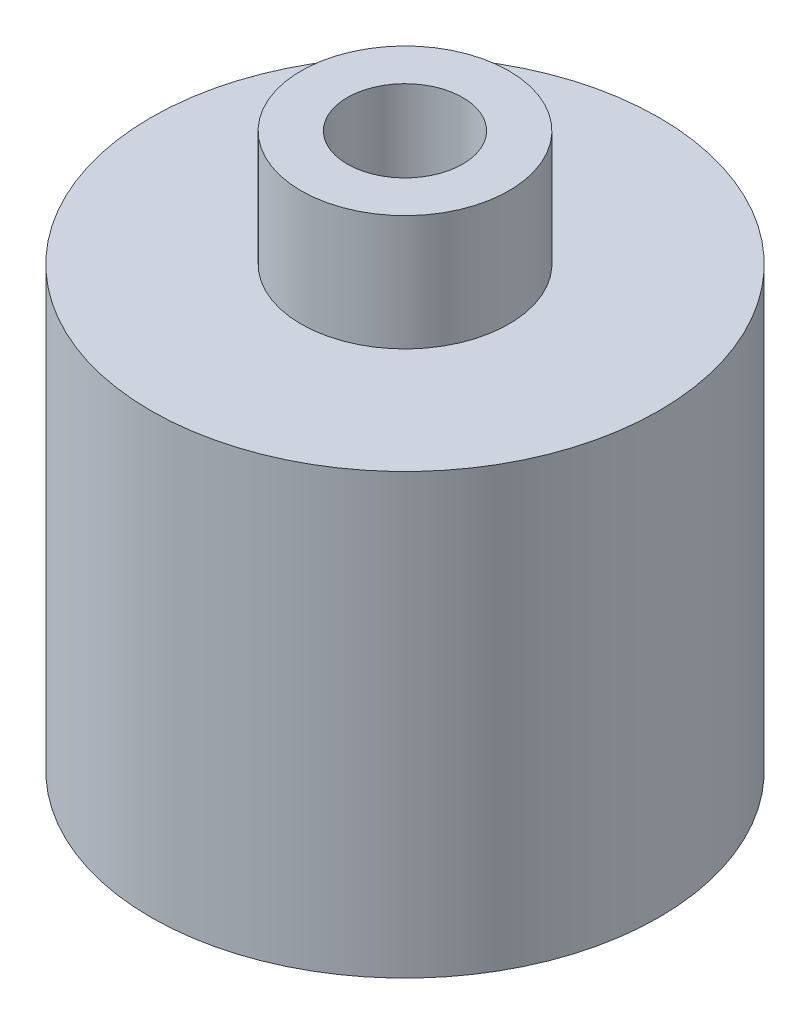
ISO-10303-21;
HEADER;
FILE_DESCRIPTION(('STEP AP214'),'2;1');
FILE_NAME('part.step','',(''),(''),'','','');
FILE_SCHEMA(('AUTOMOTIVE_DESIGN { 1 0 10303 214 1 1 1 1 }'));
ENDSEC;
DATA;
#1=APPLICATION_CONTEXT('core data for automotive mechanical design processes');
#2=APPLICATION_PROTOCOL_DEFINITION('international standard','automotive_design',2000,#1);
#3=PRODUCT_CONTEXT('',#1,'mechanical');
#4=PRODUCT('Part','Part','',(#3));
#5=PRODUCT_RELATED_PRODUCT_CATEGORY('part','',(#4));
#6=PRODUCT_DEFINITION_FORMATION('','',#4);
#7=PRODUCT_DEFINITION_CONTEXT('part definition',#1,'design');
#8=PRODUCT_DEFINITION('design','',#6,#7);
#9=PRODUCT_DEFINITION_SHAPE('','',#8);
#10=(LENGTH_UNIT() NAMED_UNIT(*) SI_UNIT(.MILLI.,.METRE.));
#11=(NAMED_UNIT(*) PLANE_ANGLE_UNIT() SI_UNIT($,.RADIAN.));
#12=(NAMED_UNIT(*) SI_UNIT($,.STERADIAN.) SOLID_ANGLE_UNIT());
#13=UNCERTAINTY_MEASURE_WITH_UNIT(LENGTH_MEASURE(1.E-05),#10,'distance_accuracy_value','');
#14=(GEOMETRIC_REPRESENTATION_CONTEXT(3) GLOBAL_UNCERTAINTY_ASSIGNED_CONTEXT((#13)) GLOBAL_UNIT_ASSIGNED_CONTEXT((#10,
#11,#12)) REPRESENTATION_CONTEXT('',''));
#15=CARTESIAN_POINT('',(0.,0.,0.));
#16=DIRECTION('',(0.,0.,1.));
#17=DIRECTION('',(1.,0.,0.));
#18=AXIS2_PLACEMENT_3D('',#15,#16,#17);
#19=CARTESIAN_POINT('',(0.,19.,0.));
#20=DIRECTION('',(0.,1.,0.));
#21=DIRECTION('',(0.,0.,1.));
#22=AXIS2_PLACEMENT_3D('',#19,#20,#21);
#23=PLANE('',#22);
#24=CARTESIAN_POINT('',(0.,19.,0.));
#25=DIRECTION('',(0.,1.,0.));
#26=DIRECTION('',(0.,0.,1.));
#27=AXIS2_PLACEMENT_3D('',#24,#25,#26);
#28=CIRCLE('',#27,11.);
#29=CARTESIAN_POINT('',(0.,19.,11.));
#30=VERTEX_POINT('',#29);
#31=EDGE_CURVE('E10',#30,#30,#28,.T.);
#32=ORIENTED_EDGE('',*,*,#31,.T.);
#33=EDGE_LOOP('',(#32));
#34=FACE_BOUND('',#33,.T.);
#35=CARTESIAN_POINT('',(0.,19.,0.));
#36=DIRECTION('',(0.,1.,0.));
#37=DIRECTION('',(0.,0.,1.));
#38=AXIS2_PLACEMENT_3D('',#35,#36,#37);
#39=CIRCLE('',#38,4.5);
#40=CARTESIAN_POINT('',(0.,19.,4.5));
#41=VERTEX_POINT('',#40);
#42=EDGE_CURVE('E50',#41,#41,#39,.T.);
#43=ORIENTED_EDGE('',*,*,#42,.F.);
#44=EDGE_LOOP('',(#43));
#45=FACE_BOUND('',#44,.T.);
#46=ADVANCED_FACE('F34',(#34,#45),#23,.T.);
#47=CARTESIAN_POINT('',(0.,0.,0.));
#48=DIRECTION('',(0.,1.,0.));
#49=DIRECTION('',(0.,0.,1.));
#50=AXIS2_PLACEMENT_3D('',#47,#48,#49);
#51=PLANE('',#50);
#52=CARTESIAN_POINT('',(0.,0.,0.));
#53=DIRECTION('',(0.,1.,0.));
#54=DIRECTION('',(0.,0.,1.));
#55=AXIS2_PLACEMENT_3D('',#52,#53,#54);
#56=CIRCLE('',#55,11.);
#57=CARTESIAN_POINT('',(0.,0.,11.));
#58=VERTEX_POINT('',#57);
#59=EDGE_CURVE('E38',#58,#58,#56,.T.);
#60=ORIENTED_EDGE('',*,*,#59,.F.);
#61=EDGE_LOOP('',(#60));
#62=FACE_BOUND('',#61,.T.);
#63=CARTESIAN_POINT('',(0.,0.,0.));
#64=DIRECTION('',(0.,1.,0.));
#65=DIRECTION('',(0.,0.,1.));
#66=AXIS2_PLACEMENT_3D('',#63,#64,#65);
#67=CIRCLE('',#66,2.5);
#68=CARTESIAN_POINT('',(0.,0.,2.5));
#69=VERTEX_POINT('',#68);
#70=EDGE_CURVE('E45',#69,#69,#67,.T.);
#71=ORIENTED_EDGE('',*,*,#70,.T.);
#72=EDGE_LOOP('',(#71));
#73=FACE_BOUND('',#72,.T.);
#74=ADVANCED_FACE('F75',(#62,#73),#51,.F.);
#75=CARTESIAN_POINT('',(0.,19.,0.));
#76=DIRECTION('',(0.,-1.,0.));
#77=DIRECTION('',(0.,0.,-1.));
#78=AXIS2_PLACEMENT_3D('',#75,#76,#77);
#79=CYLINDRICAL_SURFACE('',#78,11.);
#80=ORIENTED_EDGE('',*,*,#31,.F.);
#81=EDGE_LOOP('',(#80));
#82=FACE_BOUND('',#81,.T.);
#83=ORIENTED_EDGE('',*,*,#59,.T.);
#84=EDGE_LOOP('',(#83));
#85=FACE_BOUND('',#84,.T.);
#86=ADVANCED_FACE('F36',(#82,#85),#79,.T.);
#87=CARTESIAN_POINT('',(0.,19.,0.));
#88=DIRECTION('',(0.,-1.,0.));
#89=DIRECTION('',(0.,0.,-1.));
#90=AXIS2_PLACEMENT_3D('',#87,#88,#89);
#91=CYLINDRICAL_SURFACE('',#90,2.5);
#92=ORIENTED_EDGE('',*,*,#70,.F.);
#93=EDGE_LOOP('',(#92));
#94=FACE_BOUND('',#93,.T.);
#95=CARTESIAN_POINT('',(0.,24.,0.));
#96=DIRECTION('',(0.,1.,0.));
#97=DIRECTION('',(0.,0.,1.));
#98=AXIS2_PLACEMENT_3D('',#95,#96,#97);
#99=CIRCLE('',#98,2.5);
#100=CARTESIAN_POINT('',(0.,24.,2.5));
#101=VERTEX_POINT('',#100);
#102=EDGE_CURVE('E53',#101,#101,#99,.T.);
#103=ORIENTED_EDGE('',*,*,#102,.T.);
#104=EDGE_LOOP('',(#103));
#105=FACE_BOUND('',#104,.T.);
#106=ADVANCED_FACE('F59',(#94,#105),#91,.F.);
#107=CARTESIAN_POINT('',(0.,24.,0.));
#108=DIRECTION('',(0.,1.,0.));
#109=DIRECTION('',(0.,0.,1.));
#110=AXIS2_PLACEMENT_3D('',#107,#108,#109);
#111=PLANE('',#110);
#112=CARTESIAN_POINT('',(0.,24.,0.));
#113=DIRECTION('',(0.,1.,0.));
#114=DIRECTION('',(0.,0.,1.));
#115=AXIS2_PLACEMENT_3D('',#112,#113,#114);
#116=CIRCLE('',#115,4.5);
#117=CARTESIAN_POINT('',(0.,24.,4.5));
#118=VERTEX_POINT('',#117);
#119=EDGE_CURVE('E49',#118,#118,#116,.T.);
#120=ORIENTED_EDGE('',*,*,#119,.T.);
#121=EDGE_LOOP('',(#120));
#122=FACE_BOUND('',#121,.T.);
#123=ORIENTED_EDGE('',*,*,#102,.F.);
#124=EDGE_LOOP('',(#123));
#125=FACE_BOUND('',#124,.T.);
#126=ADVANCED_FACE('F61',(#122,#125),#111,.T.);
#127=CARTESIAN_POINT('',(0.,24.,0.));
#128=DIRECTION('',(0.,-1.,0.));
#129=DIRECTION('',(0.,0.,-1.));
#130=AXIS2_PLACEMENT_3D('',#127,#128,#129);
#131=CYLINDRICAL_SURFACE('',#130,4.5);
#132=ORIENTED_EDGE('',*,*,#119,.F.);
#133=EDGE_LOOP('',(#132));
#134=FACE_BOUND('',#133,.T.);
#135=ORIENTED_EDGE('',*,*,#42,.T.);
#136=EDGE_LOOP('',(#135));
#137=FACE_BOUND('',#136,.T.);
#138=ADVANCED_FACE('F63',(#134,#137),#131,.T.);
#139=CLOSED_SHELL('',(#46,#74,#86,#106,#126,#138));
#140=MANIFOLD_SOLID_BREP('B2',#139);
#141=ADVANCED_BREP_SHAPE_REPRESENTATION('',(#18,#140),#14);
#142=SHAPE_DEFINITION_REPRESENTATION(#9,#141);
ENDSEC;
END-ISO-10303-21;
